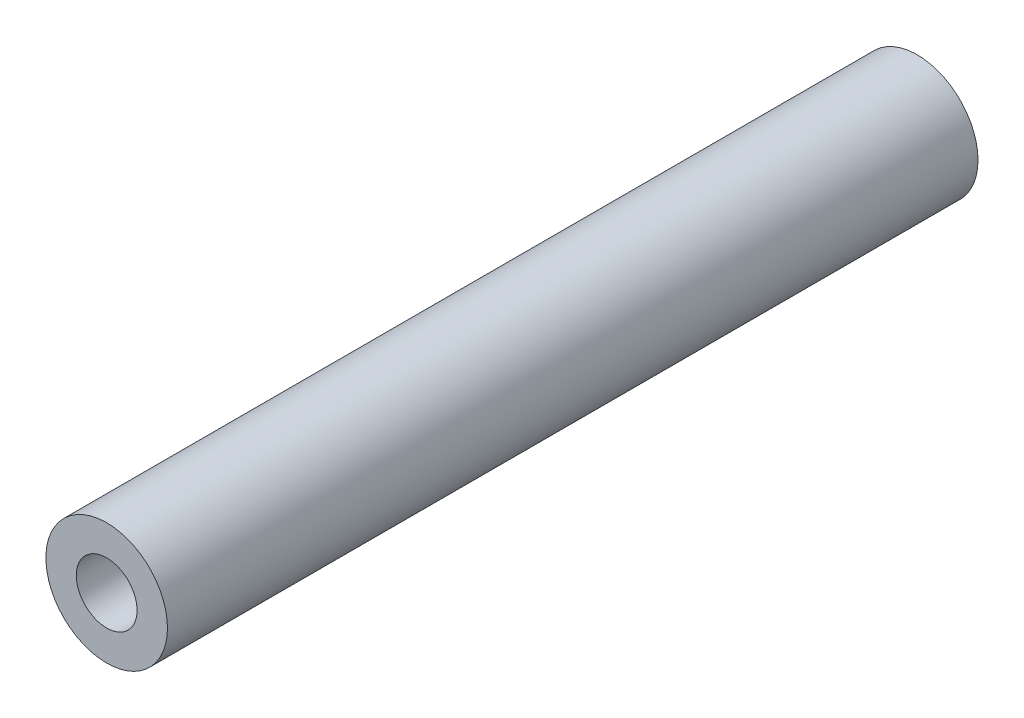
ISO-10303-21;
HEADER;
FILE_DESCRIPTION(('STEP AP214'),'2;1');
FILE_NAME('part.step','',(''),(''),'','','');
FILE_SCHEMA(('AUTOMOTIVE_DESIGN { 1 0 10303 214 1 1 1 1 }'));
ENDSEC;
DATA;
#1=APPLICATION_CONTEXT('core data for automotive mechanical design processes');
#2=APPLICATION_PROTOCOL_DEFINITION('international standard','automotive_design',2000,#1);
#3=PRODUCT_CONTEXT('',#1,'mechanical');
#4=PRODUCT('Part','Part','',(#3));
#5=PRODUCT_RELATED_PRODUCT_CATEGORY('part','',(#4));
#6=PRODUCT_DEFINITION_FORMATION('','',#4);
#7=PRODUCT_DEFINITION_CONTEXT('part definition',#1,'design');
#8=PRODUCT_DEFINITION('design','',#6,#7);
#9=PRODUCT_DEFINITION_SHAPE('','',#8);
#10=(LENGTH_UNIT() NAMED_UNIT(*) SI_UNIT(.MILLI.,.METRE.));
#11=(NAMED_UNIT(*) PLANE_ANGLE_UNIT() SI_UNIT($,.RADIAN.));
#12=(NAMED_UNIT(*) SI_UNIT($,.STERADIAN.) SOLID_ANGLE_UNIT());
#13=UNCERTAINTY_MEASURE_WITH_UNIT(LENGTH_MEASURE(1.E-05),#10,'distance_accuracy_value','');
#14=(GEOMETRIC_REPRESENTATION_CONTEXT(3) GLOBAL_UNCERTAINTY_ASSIGNED_CONTEXT((#13)) GLOBAL_UNIT_ASSIGNED_CONTEXT((#10,
#11,#12)) REPRESENTATION_CONTEXT('',''));
#15=CARTESIAN_POINT('',(0.,0.,0.));
#16=DIRECTION('',(0.,0.,1.));
#17=DIRECTION('',(1.,0.,0.));
#18=AXIS2_PLACEMENT_3D('',#15,#16,#17);
#19=CARTESIAN_POINT('',(0.,0.,40.));
#20=DIRECTION('',(0.,0.,1.));
#21=DIRECTION('',(1.,0.,0.));
#22=AXIS2_PLACEMENT_3D('',#19,#20,#21);
#23=PLANE('',#22);
#24=CARTESIAN_POINT('',(0.,0.,40.));
#25=DIRECTION('',(0.,0.,1.));
#26=DIRECTION('',(1.,0.,0.));
#27=AXIS2_PLACEMENT_3D('',#24,#25,#26);
#28=CIRCLE('',#27,3.);
#29=CARTESIAN_POINT('',(3.,0.,40.));
#30=VERTEX_POINT('',#29);
#31=EDGE_CURVE('E10',#30,#30,#28,.T.);
#32=ORIENTED_EDGE('',*,*,#31,.T.);
#33=EDGE_LOOP('',(#32));
#34=FACE_BOUND('',#33,.T.);
#35=CARTESIAN_POINT('',(0.,0.,40.));
#36=DIRECTION('',(0.,0.,1.));
#37=DIRECTION('',(1.,0.,0.));
#38=AXIS2_PLACEMENT_3D('',#35,#36,#37);
#39=CIRCLE('',#38,1.5);
#40=CARTESIAN_POINT('',(1.5,0.,40.));
#41=VERTEX_POINT('',#40);
#42=EDGE_CURVE('E54',#41,#41,#39,.T.);
#43=ORIENTED_EDGE('',*,*,#42,.F.);
#44=EDGE_LOOP('',(#43));
#45=FACE_BOUND('',#44,.T.);
#46=ADVANCED_FACE('F41',(#34,#45),#23,.T.);
#47=CARTESIAN_POINT('',(0.,0.,0.));
#48=DIRECTION('',(0.,0.,1.));
#49=DIRECTION('',(1.,0.,0.));
#50=AXIS2_PLACEMENT_3D('',#47,#48,#49);
#51=PLANE('',#50);
#52=CARTESIAN_POINT('',(0.,0.,0.));
#53=DIRECTION('',(0.,0.,1.));
#54=DIRECTION('',(1.,0.,0.));
#55=AXIS2_PLACEMENT_3D('',#52,#53,#54);
#56=CIRCLE('',#55,3.);
#57=CARTESIAN_POINT('',(3.,0.,0.));
#58=VERTEX_POINT('',#57);
#59=EDGE_CURVE('E45',#58,#58,#56,.T.);
#60=ORIENTED_EDGE('',*,*,#59,.F.);
#61=EDGE_LOOP('',(#60));
#62=FACE_BOUND('',#61,.T.);
#63=CARTESIAN_POINT('',(0.,0.,0.));
#64=DIRECTION('',(0.,0.,1.));
#65=DIRECTION('',(1.,0.,0.));
#66=AXIS2_PLACEMENT_3D('',#63,#64,#65);
#67=CIRCLE('',#66,1.5);
#68=CARTESIAN_POINT('',(1.5,0.,0.));
#69=VERTEX_POINT('',#68);
#70=EDGE_CURVE('E56',#69,#69,#67,.T.);
#71=ORIENTED_EDGE('',*,*,#70,.T.);
#72=EDGE_LOOP('',(#71));
#73=FACE_BOUND('',#72,.T.);
#74=ADVANCED_FACE('F68',(#62,#73),#51,.F.);
#75=CARTESIAN_POINT('',(0.,0.,40.));
#76=DIRECTION('',(0.,0.,-1.));
#77=DIRECTION('',(-1.,0.,0.));
#78=AXIS2_PLACEMENT_3D('',#75,#76,#77);
#79=CYLINDRICAL_SURFACE('',#78,3.);
#80=ORIENTED_EDGE('',*,*,#31,.F.);
#81=EDGE_LOOP('',(#80));
#82=FACE_BOUND('',#81,.T.);
#83=ORIENTED_EDGE('',*,*,#59,.T.);
#84=EDGE_LOOP('',(#83));
#85=FACE_BOUND('',#84,.T.);
#86=ADVANCED_FACE('F43',(#82,#85),#79,.T.);
#87=CARTESIAN_POINT('',(0.,0.,40.));
#88=DIRECTION('',(0.,0.,-1.));
#89=DIRECTION('',(-1.,0.,0.));
#90=AXIS2_PLACEMENT_3D('',#87,#88,#89);
#91=CYLINDRICAL_SURFACE('',#90,1.5);
#92=ORIENTED_EDGE('',*,*,#42,.T.);
#93=EDGE_LOOP('',(#92));
#94=FACE_BOUND('',#93,.T.);
#95=ORIENTED_EDGE('',*,*,#70,.F.);
#96=EDGE_LOOP('',(#95));
#97=FACE_BOUND('',#96,.T.);
#98=ADVANCED_FACE('F64',(#94,#97),#91,.F.);
#99=CLOSED_SHELL('',(#46,#74,#86,#98));
#100=MANIFOLD_SOLID_BREP('B2',#99);
#101=ADVANCED_BREP_SHAPE_REPRESENTATION('',(#18,#100),#14);
#102=SHAPE_DEFINITION_REPRESENTATION(#9,#101);
ENDSEC;
END-ISO-10303-21;
